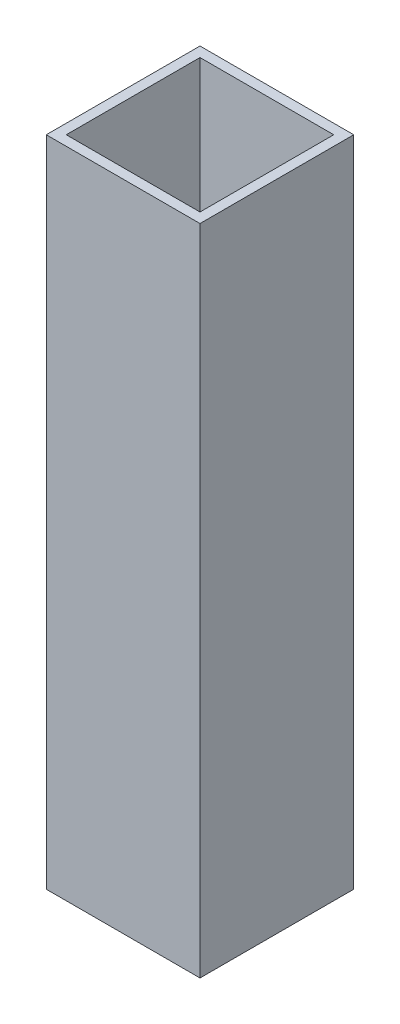
ISO-10303-21;
HEADER;
FILE_DESCRIPTION(('STEP AP214'),'2;1');
FILE_NAME('part.step','',(''),(''),'','','');
FILE_SCHEMA(('AUTOMOTIVE_DESIGN { 1 0 10303 214 1 1 1 1 }'));
ENDSEC;
DATA;
#1=APPLICATION_CONTEXT('core data for automotive mechanical design processes');
#2=APPLICATION_PROTOCOL_DEFINITION('international standard','automotive_design',2000,#1);
#3=PRODUCT_CONTEXT('',#1,'mechanical');
#4=PRODUCT('Part','Part','',(#3));
#5=PRODUCT_RELATED_PRODUCT_CATEGORY('part','',(#4));
#6=PRODUCT_DEFINITION_FORMATION('','',#4);
#7=PRODUCT_DEFINITION_CONTEXT('part definition',#1,'design');
#8=PRODUCT_DEFINITION('design','',#6,#7);
#9=PRODUCT_DEFINITION_SHAPE('','',#8);
#10=(LENGTH_UNIT() NAMED_UNIT(*) SI_UNIT(.MILLI.,.METRE.));
#11=(NAMED_UNIT(*) PLANE_ANGLE_UNIT() SI_UNIT($,.RADIAN.));
#12=(NAMED_UNIT(*) SI_UNIT($,.STERADIAN.) SOLID_ANGLE_UNIT());
#13=UNCERTAINTY_MEASURE_WITH_UNIT(LENGTH_MEASURE(1.E-05),#10,'distance_accuracy_value','');
#14=(GEOMETRIC_REPRESENTATION_CONTEXT(3) GLOBAL_UNCERTAINTY_ASSIGNED_CONTEXT((#13)) GLOBAL_UNIT_ASSIGNED_CONTEXT((#10,
#11,#12)) REPRESENTATION_CONTEXT('',''));
#15=CARTESIAN_POINT('',(0.,0.,0.));
#16=DIRECTION('',(0.,0.,1.));
#17=DIRECTION('',(1.,0.,0.));
#18=AXIS2_PLACEMENT_3D('',#15,#16,#17);
#19=CARTESIAN_POINT('',(0.,107.95,0.));
#20=DIRECTION('',(1.,0.,0.));
#21=DIRECTION('',(0.,0.,-1.));
#22=AXIS2_PLACEMENT_3D('',#19,#20,#21);
#23=PLANE('',#22);
#24=DIRECTION('',(0.,0.,1.));
#25=VECTOR('',#24,1.);
#26=CARTESIAN_POINT('',(0.,0.,0.));
#27=LINE('',#26,#25);
#28=CARTESIAN_POINT('',(0.,0.,0.));
#29=VERTEX_POINT('',#28);
#30=CARTESIAN_POINT('',(0.,0.,25.4));
#31=VERTEX_POINT('',#30);
#32=EDGE_CURVE('E141',#29,#31,#27,.T.);
#33=ORIENTED_EDGE('',*,*,#32,.T.);
#34=DIRECTION('',(0.,-1.,0.));
#35=VECTOR('',#34,1.);
#36=CARTESIAN_POINT('',(0.,107.95,25.4));
#37=LINE('',#36,#35);
#38=CARTESIAN_POINT('',(0.,107.95,25.4));
#39=VERTEX_POINT('',#38);
#40=EDGE_CURVE('E11',#39,#31,#37,.T.);
#41=ORIENTED_EDGE('',*,*,#40,.F.);
#42=DIRECTION('',(0.,0.,1.));
#43=VECTOR('',#42,1.);
#44=CARTESIAN_POINT('',(0.,107.95,0.));
#45=LINE('',#44,#43);
#46=CARTESIAN_POINT('',(0.,107.95,0.));
#47=VERTEX_POINT('',#46);
#48=EDGE_CURVE('E145',#47,#39,#45,.T.);
#49=ORIENTED_EDGE('',*,*,#48,.F.);
#50=DIRECTION('',(0.,-1.,0.));
#51=VECTOR('',#50,1.);
#52=CARTESIAN_POINT('',(0.,107.95,0.));
#53=LINE('',#52,#51);
#54=EDGE_CURVE('E151',#47,#29,#53,.T.);
#55=ORIENTED_EDGE('',*,*,#54,.T.);
#56=EDGE_LOOP('',(#33,#41,#49,#55));
#57=FACE_BOUND('',#56,.T.);
#58=ADVANCED_FACE('F33',(#57),#23,.F.);
#59=CARTESIAN_POINT('',(0.,107.95,25.4));
#60=DIRECTION('',(0.,0.,-1.));
#61=DIRECTION('',(-1.,0.,0.));
#62=AXIS2_PLACEMENT_3D('',#59,#60,#61);
#63=PLANE('',#62);
#64=DIRECTION('',(1.,0.,0.));
#65=VECTOR('',#64,1.);
#66=CARTESIAN_POINT('',(0.,0.,25.4));
#67=LINE('',#66,#65);
#68=CARTESIAN_POINT('',(25.4,0.,25.4));
#69=VERTEX_POINT('',#68);
#70=EDGE_CURVE('E154',#31,#69,#67,.T.);
#71=ORIENTED_EDGE('',*,*,#70,.T.);
#72=DIRECTION('',(0.,-1.,0.));
#73=VECTOR('',#72,1.);
#74=CARTESIAN_POINT('',(25.4,107.95,25.4));
#75=LINE('',#74,#73);
#76=CARTESIAN_POINT('',(25.4,107.95,25.4));
#77=VERTEX_POINT('',#76);
#78=EDGE_CURVE('E40',#77,#69,#75,.T.);
#79=ORIENTED_EDGE('',*,*,#78,.F.);
#80=DIRECTION('',(1.,0.,0.));
#81=VECTOR('',#80,1.);
#82=CARTESIAN_POINT('',(0.,107.95,25.4));
#83=LINE('',#82,#81);
#84=EDGE_CURVE('E84',#39,#77,#83,.T.);
#85=ORIENTED_EDGE('',*,*,#84,.F.);
#86=ORIENTED_EDGE('',*,*,#40,.T.);
#87=EDGE_LOOP('',(#71,#79,#85,#86));
#88=FACE_BOUND('',#87,.T.);
#89=ADVANCED_FACE('F183',(#88),#63,.F.);
#90=CARTESIAN_POINT('',(25.4,107.95,0.));
#91=DIRECTION('',(-1.,0.,0.));
#92=DIRECTION('',(0.,0.,1.));
#93=AXIS2_PLACEMENT_3D('',#90,#91,#92);
#94=PLANE('',#93);
#95=DIRECTION('',(0.,0.,-1.));
#96=VECTOR('',#95,1.);
#97=CARTESIAN_POINT('',(25.4,0.,0.));
#98=LINE('',#97,#96);
#99=CARTESIAN_POINT('',(25.4,0.,0.));
#100=VERTEX_POINT('',#99);
#101=EDGE_CURVE('E156',#69,#100,#98,.T.);
#102=ORIENTED_EDGE('',*,*,#101,.T.);
#103=DIRECTION('',(0.,-1.,0.));
#104=VECTOR('',#103,1.);
#105=CARTESIAN_POINT('',(25.4,107.95,0.));
#106=LINE('',#105,#104);
#107=CARTESIAN_POINT('',(25.4,107.95,0.));
#108=VERTEX_POINT('',#107);
#109=EDGE_CURVE('E160',#108,#100,#106,.T.);
#110=ORIENTED_EDGE('',*,*,#109,.F.);
#111=DIRECTION('',(0.,0.,-1.));
#112=VECTOR('',#111,1.);
#113=CARTESIAN_POINT('',(25.4,107.95,0.));
#114=LINE('',#113,#112);
#115=EDGE_CURVE('E148',#77,#108,#114,.T.);
#116=ORIENTED_EDGE('',*,*,#115,.F.);
#117=ORIENTED_EDGE('',*,*,#78,.T.);
#118=EDGE_LOOP('',(#102,#110,#116,#117));
#119=FACE_BOUND('',#118,.T.);
#120=ADVANCED_FACE('F165',(#119),#94,.F.);
#121=CARTESIAN_POINT('',(0.,107.95,0.));
#122=DIRECTION('',(0.,0.,1.));
#123=DIRECTION('',(1.,0.,0.));
#124=AXIS2_PLACEMENT_3D('',#121,#122,#123);
#125=PLANE('',#124);
#126=DIRECTION('',(-1.,0.,0.));
#127=VECTOR('',#126,1.);
#128=CARTESIAN_POINT('',(0.,0.,0.));
#129=LINE('',#128,#127);
#130=EDGE_CURVE('E77',#100,#29,#129,.T.);
#131=ORIENTED_EDGE('',*,*,#130,.T.);
#132=ORIENTED_EDGE('',*,*,#54,.F.);
#133=DIRECTION('',(-1.,0.,0.));
#134=VECTOR('',#133,1.);
#135=CARTESIAN_POINT('',(0.,107.95,0.));
#136=LINE('',#135,#134);
#137=EDGE_CURVE('E56',#108,#47,#136,.T.);
#138=ORIENTED_EDGE('',*,*,#137,.F.);
#139=ORIENTED_EDGE('',*,*,#109,.T.);
#140=EDGE_LOOP('',(#131,#132,#138,#139));
#141=FACE_BOUND('',#140,.T.);
#142=ADVANCED_FACE('F173',(#141),#125,.F.);
#143=CARTESIAN_POINT('',(0.,107.95,0.));
#144=DIRECTION('',(0.,1.,0.));
#145=DIRECTION('',(0.,0.,1.));
#146=AXIS2_PLACEMENT_3D('',#143,#144,#145);
#147=PLANE('',#146);
#148=DIRECTION('',(0.,0.,1.));
#149=VECTOR('',#148,1.);
#150=CARTESIAN_POINT('',(1.651,107.95,1.651));
#151=LINE('',#150,#149);
#152=CARTESIAN_POINT('',(1.651,107.95,1.651));
#153=VERTEX_POINT('',#152);
#154=CARTESIAN_POINT('',(1.651,107.95,23.749));
#155=VERTEX_POINT('',#154);
#156=EDGE_CURVE('E47',#153,#155,#151,.T.);
#157=ORIENTED_EDGE('',*,*,#156,.F.);
#158=DIRECTION('',(-1.,0.,0.));
#159=VECTOR('',#158,1.);
#160=CARTESIAN_POINT('',(1.651,107.95,1.651));
#161=LINE('',#160,#159);
#162=CARTESIAN_POINT('',(23.749,107.95,1.651));
#163=VERTEX_POINT('',#162);
#164=EDGE_CURVE('E126',#163,#153,#161,.T.);
#165=ORIENTED_EDGE('',*,*,#164,.F.);
#166=DIRECTION('',(0.,0.,-1.));
#167=VECTOR('',#166,1.);
#168=CARTESIAN_POINT('',(23.749,107.95,1.651));
#169=LINE('',#168,#167);
#170=CARTESIAN_POINT('',(23.749,107.95,23.749));
#171=VERTEX_POINT('',#170);
#172=EDGE_CURVE('E129',#171,#163,#169,.T.);
#173=ORIENTED_EDGE('',*,*,#172,.F.);
#174=DIRECTION('',(1.,0.,0.));
#175=VECTOR('',#174,1.);
#176=CARTESIAN_POINT('',(1.651,107.95,23.749));
#177=LINE('',#176,#175);
#178=EDGE_CURVE('E135',#155,#171,#177,.T.);
#179=ORIENTED_EDGE('',*,*,#178,.F.);
#180=EDGE_LOOP('',(#157,#165,#173,#179));
#181=FACE_BOUND('',#180,.T.);
#182=ORIENTED_EDGE('',*,*,#48,.T.);
#183=ORIENTED_EDGE('',*,*,#84,.T.);
#184=ORIENTED_EDGE('',*,*,#115,.T.);
#185=ORIENTED_EDGE('',*,*,#137,.T.);
#186=EDGE_LOOP('',(#182,#183,#184,#185));
#187=FACE_BOUND('',#186,.T.);
#188=ADVANCED_FACE('F175',(#181,#187),#147,.T.);
#189=CARTESIAN_POINT('',(0.,0.,0.));
#190=DIRECTION('',(0.,1.,0.));
#191=DIRECTION('',(0.,0.,1.));
#192=AXIS2_PLACEMENT_3D('',#189,#190,#191);
#193=PLANE('',#192);
#194=ORIENTED_EDGE('',*,*,#32,.F.);
#195=ORIENTED_EDGE('',*,*,#130,.F.);
#196=ORIENTED_EDGE('',*,*,#101,.F.);
#197=ORIENTED_EDGE('',*,*,#70,.F.);
#198=EDGE_LOOP('',(#194,#195,#196,#197));
#199=FACE_BOUND('',#198,.T.);
#200=ADVANCED_FACE('F169',(#199),#193,.F.);
#201=CARTESIAN_POINT('',(1.651,31.75,1.651));
#202=DIRECTION('',(-1.,0.,0.));
#203=DIRECTION('',(0.,0.,1.));
#204=AXIS2_PLACEMENT_3D('',#201,#202,#203);
#205=PLANE('',#204);
#206=ORIENTED_EDGE('',*,*,#156,.T.);
#207=DIRECTION('',(0.,1.,0.));
#208=VECTOR('',#207,1.);
#209=CARTESIAN_POINT('',(1.651,31.75,23.749));
#210=LINE('',#209,#208);
#211=CARTESIAN_POINT('',(1.651,31.75,23.749));
#212=VERTEX_POINT('',#211);
#213=EDGE_CURVE('E104',#212,#155,#210,.T.);
#214=ORIENTED_EDGE('',*,*,#213,.F.);
#215=DIRECTION('',(0.,0.,1.));
#216=VECTOR('',#215,1.);
#217=CARTESIAN_POINT('',(1.651,31.75,1.651));
#218=LINE('',#217,#216);
#219=CARTESIAN_POINT('',(1.651,31.75,1.651));
#220=VERTEX_POINT('',#219);
#221=EDGE_CURVE('E108',#220,#212,#218,.T.);
#222=ORIENTED_EDGE('',*,*,#221,.F.);
#223=DIRECTION('',(0.,1.,0.));
#224=VECTOR('',#223,1.);
#225=CARTESIAN_POINT('',(1.651,31.75,1.651));
#226=LINE('',#225,#224);
#227=EDGE_CURVE('E139',#220,#153,#226,.T.);
#228=ORIENTED_EDGE('',*,*,#227,.T.);
#229=EDGE_LOOP('',(#206,#214,#222,#228));
#230=FACE_BOUND('',#229,.T.);
#231=ADVANCED_FACE('F106',(#230),#205,.F.);
#232=CARTESIAN_POINT('',(1.651,31.75,1.651));
#233=DIRECTION('',(0.,0.,-1.));
#234=DIRECTION('',(-1.,0.,0.));
#235=AXIS2_PLACEMENT_3D('',#232,#233,#234);
#236=PLANE('',#235);
#237=ORIENTED_EDGE('',*,*,#164,.T.);
#238=ORIENTED_EDGE('',*,*,#227,.F.);
#239=DIRECTION('',(-1.,0.,0.));
#240=VECTOR('',#239,1.);
#241=CARTESIAN_POINT('',(1.651,31.75,1.651));
#242=LINE('',#241,#240);
#243=CARTESIAN_POINT('',(23.749,31.75,1.651));
#244=VERTEX_POINT('',#243);
#245=EDGE_CURVE('E114',#244,#220,#242,.T.);
#246=ORIENTED_EDGE('',*,*,#245,.F.);
#247=DIRECTION('',(0.,1.,0.));
#248=VECTOR('',#247,1.);
#249=CARTESIAN_POINT('',(23.749,31.75,1.651));
#250=LINE('',#249,#248);
#251=EDGE_CURVE('E142',#244,#163,#250,.T.);
#252=ORIENTED_EDGE('',*,*,#251,.T.);
#253=EDGE_LOOP('',(#237,#238,#246,#252));
#254=FACE_BOUND('',#253,.T.);
#255=ADVANCED_FACE('F222',(#254),#236,.F.);
#256=CARTESIAN_POINT('',(23.749,31.75,1.651));
#257=DIRECTION('',(1.,0.,0.));
#258=DIRECTION('',(0.,0.,-1.));
#259=AXIS2_PLACEMENT_3D('',#256,#257,#258);
#260=PLANE('',#259);
#261=ORIENTED_EDGE('',*,*,#172,.T.);
#262=ORIENTED_EDGE('',*,*,#251,.F.);
#263=DIRECTION('',(0.,0.,-1.));
#264=VECTOR('',#263,1.);
#265=CARTESIAN_POINT('',(23.749,31.75,1.651));
#266=LINE('',#265,#264);
#267=CARTESIAN_POINT('',(23.749,31.75,23.749));
#268=VERTEX_POINT('',#267);
#269=EDGE_CURVE('E122',#268,#244,#266,.T.);
#270=ORIENTED_EDGE('',*,*,#269,.F.);
#271=DIRECTION('',(0.,1.,0.));
#272=VECTOR('',#271,1.);
#273=CARTESIAN_POINT('',(23.749,31.75,23.749));
#274=LINE('',#273,#272);
#275=EDGE_CURVE('E113',#268,#171,#274,.T.);
#276=ORIENTED_EDGE('',*,*,#275,.T.);
#277=EDGE_LOOP('',(#261,#262,#270,#276));
#278=FACE_BOUND('',#277,.T.);
#279=ADVANCED_FACE('F231',(#278),#260,.F.);
#280=CARTESIAN_POINT('',(1.651,31.75,23.749));
#281=DIRECTION('',(0.,0.,1.));
#282=DIRECTION('',(1.,0.,0.));
#283=AXIS2_PLACEMENT_3D('',#280,#281,#282);
#284=PLANE('',#283);
#285=ORIENTED_EDGE('',*,*,#178,.T.);
#286=ORIENTED_EDGE('',*,*,#275,.F.);
#287=DIRECTION('',(1.,0.,0.));
#288=VECTOR('',#287,1.);
#289=CARTESIAN_POINT('',(1.651,31.75,23.749));
#290=LINE('',#289,#288);
#291=EDGE_CURVE('E117',#212,#268,#290,.T.);
#292=ORIENTED_EDGE('',*,*,#291,.F.);
#293=ORIENTED_EDGE('',*,*,#213,.T.);
#294=EDGE_LOOP('',(#285,#286,#292,#293));
#295=FACE_BOUND('',#294,.T.);
#296=ADVANCED_FACE('F118',(#295),#284,.F.);
#297=CARTESIAN_POINT('',(0.,31.75,0.));
#298=DIRECTION('',(0.,1.,0.));
#299=DIRECTION('',(0.,0.,1.));
#300=AXIS2_PLACEMENT_3D('',#297,#298,#299);
#301=PLANE('',#300);
#302=ORIENTED_EDGE('',*,*,#221,.T.);
#303=ORIENTED_EDGE('',*,*,#291,.T.);
#304=ORIENTED_EDGE('',*,*,#269,.T.);
#305=ORIENTED_EDGE('',*,*,#245,.T.);
#306=EDGE_LOOP('',(#302,#303,#304,#305));
#307=FACE_BOUND('',#306,.T.);
#308=ADVANCED_FACE('F124',(#307),#301,.T.);
#309=CLOSED_SHELL('',(#58,#89,#120,#142,#188,#200,#231,#255,#279,#296,#308));
#310=MANIFOLD_SOLID_BREP('B2',#309);
#311=ADVANCED_BREP_SHAPE_REPRESENTATION('',(#18,#310),#14);
#312=SHAPE_DEFINITION_REPRESENTATION(#9,#311);
ENDSEC;
END-ISO-10303-21;
